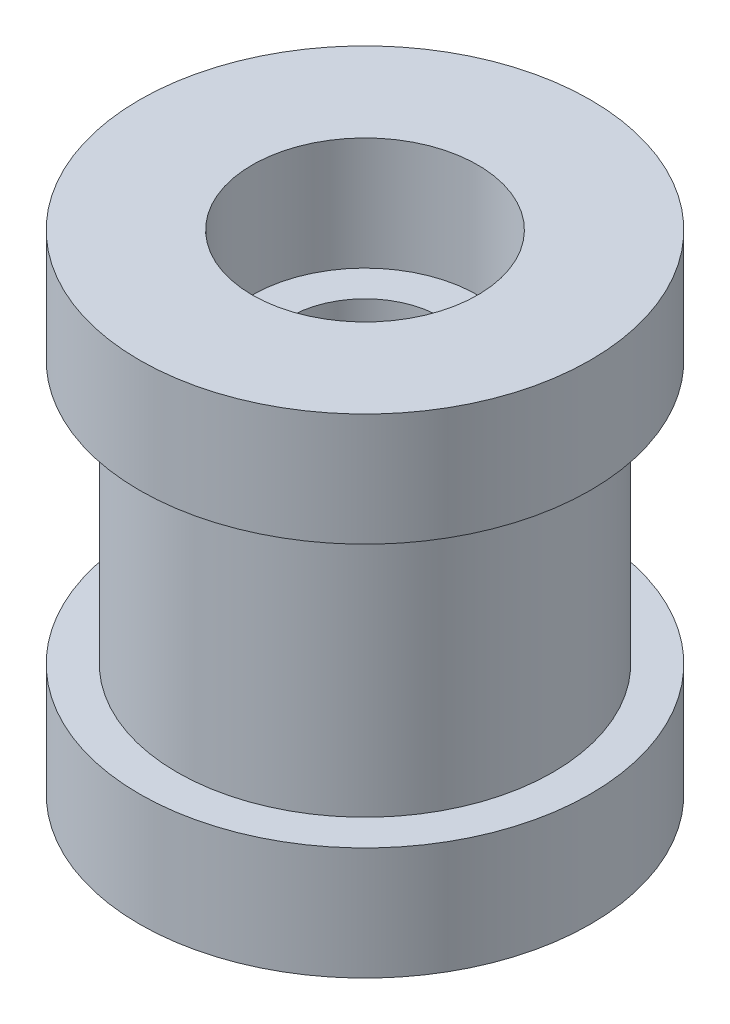
ISO-10303-21;
HEADER;
FILE_DESCRIPTION(('STEP AP214'),'2;1');
FILE_NAME('part.step','',(''),(''),'','','');
FILE_SCHEMA(('AUTOMOTIVE_DESIGN { 1 0 10303 214 1 1 1 1 }'));
ENDSEC;
DATA;
#1=APPLICATION_CONTEXT('core data for automotive mechanical design processes');
#2=APPLICATION_PROTOCOL_DEFINITION('international standard','automotive_design',2000,#1);
#3=PRODUCT_CONTEXT('',#1,'mechanical');
#4=PRODUCT('Part','Part','',(#3));
#5=PRODUCT_RELATED_PRODUCT_CATEGORY('part','',(#4));
#6=PRODUCT_DEFINITION_FORMATION('','',#4);
#7=PRODUCT_DEFINITION_CONTEXT('part definition',#1,'design');
#8=PRODUCT_DEFINITION('design','',#6,#7);
#9=PRODUCT_DEFINITION_SHAPE('','',#8);
#10=(LENGTH_UNIT() NAMED_UNIT(*) SI_UNIT(.MILLI.,.METRE.));
#11=(NAMED_UNIT(*) PLANE_ANGLE_UNIT() SI_UNIT($,.RADIAN.));
#12=(NAMED_UNIT(*) SI_UNIT($,.STERADIAN.) SOLID_ANGLE_UNIT());
#13=UNCERTAINTY_MEASURE_WITH_UNIT(LENGTH_MEASURE(1.E-05),#10,'distance_accuracy_value','');
#14=(GEOMETRIC_REPRESENTATION_CONTEXT(3) GLOBAL_UNCERTAINTY_ASSIGNED_CONTEXT((#13)) GLOBAL_UNIT_ASSIGNED_CONTEXT((#10,
#11,#12)) REPRESENTATION_CONTEXT('',''));
#15=CARTESIAN_POINT('',(0.,0.,0.));
#16=DIRECTION('',(0.,0.,1.));
#17=DIRECTION('',(1.,0.,0.));
#18=AXIS2_PLACEMENT_3D('',#15,#16,#17);
#19=CARTESIAN_POINT('',(0.,96.4583718666393,0.));
#20=DIRECTION('',(0.,1.,0.));
#21=DIRECTION('',(0.,0.,1.));
#22=AXIS2_PLACEMENT_3D('',#19,#20,#21);
#23=CYLINDRICAL_SURFACE('',#22,60.);
#24=CARTESIAN_POINT('',(0.,36.4841116520953,0.));
#25=DIRECTION('',(0.,1.,0.));
#26=DIRECTION('',(0.,0.,1.));
#27=AXIS2_PLACEMENT_3D('',#24,#25,#26);
#28=CIRCLE('',#27,60.);
#29=CARTESIAN_POINT('',(0.,36.4841116520953,60.));
#30=VERTEX_POINT('',#29);
#31=EDGE_CURVE('E10',#30,#30,#28,.T.);
#32=ORIENTED_EDGE('',*,*,#31,.F.);
#33=EDGE_LOOP('',(#32));
#34=FACE_BOUND('',#33,.T.);
#35=CARTESIAN_POINT('',(0.,6.48411165209527,0.));
#36=DIRECTION('',(0.,1.,0.));
#37=DIRECTION('',(0.,0.,1.));
#38=AXIS2_PLACEMENT_3D('',#35,#36,#37);
#39=CIRCLE('',#38,60.);
#40=CARTESIAN_POINT('',(0.,6.48411165209527,60.));
#41=VERTEX_POINT('',#40);
#42=EDGE_CURVE('E85',#41,#41,#39,.T.);
#43=ORIENTED_EDGE('',*,*,#42,.T.);
#44=EDGE_LOOP('',(#43));
#45=FACE_BOUND('',#44,.T.);
#46=ADVANCED_FACE('F33',(#34,#45),#23,.T.);
#47=CARTESIAN_POINT('',(-45.,36.4841116520953,0.));
#48=DIRECTION('',(0.,-1.,0.));
#49=DIRECTION('',(0.,0.,-1.));
#50=AXIS2_PLACEMENT_3D('',#47,#48,#49);
#51=PLANE('',#50);
#52=CARTESIAN_POINT('',(0.,36.4841116520953,0.));
#53=DIRECTION('',(0.,1.,0.));
#54=DIRECTION('',(0.,0.,1.));
#55=AXIS2_PLACEMENT_3D('',#52,#53,#54);
#56=CIRCLE('',#55,30.);
#57=CARTESIAN_POINT('',(0.,36.4841116520953,30.));
#58=VERTEX_POINT('',#57);
#59=EDGE_CURVE('E39',#58,#58,#56,.T.);
#60=ORIENTED_EDGE('',*,*,#59,.F.);
#61=EDGE_LOOP('',(#60));
#62=FACE_BOUND('',#61,.T.);
#63=ORIENTED_EDGE('',*,*,#31,.T.);
#64=EDGE_LOOP('',(#63));
#65=FACE_BOUND('',#64,.T.);
#66=ADVANCED_FACE('F170',(#62,#65),#51,.F.);
#67=CARTESIAN_POINT('',(0.,96.4583718666393,0.));
#68=DIRECTION('',(0.,1.,0.));
#69=DIRECTION('',(0.,0.,1.));
#70=AXIS2_PLACEMENT_3D('',#67,#68,#69);
#71=CYLINDRICAL_SURFACE('',#70,30.);
#72=CARTESIAN_POINT('',(0.,6.48411165209527,0.));
#73=DIRECTION('',(0.,1.,0.));
#74=DIRECTION('',(0.,0.,1.));
#75=AXIS2_PLACEMENT_3D('',#72,#73,#74);
#76=CIRCLE('',#75,30.);
#77=CARTESIAN_POINT('',(0.,6.48411165209527,30.));
#78=VERTEX_POINT('',#77);
#79=EDGE_CURVE('E43',#78,#78,#76,.T.);
#80=ORIENTED_EDGE('',*,*,#79,.F.);
#81=EDGE_LOOP('',(#80));
#82=FACE_BOUND('',#81,.T.);
#83=ORIENTED_EDGE('',*,*,#59,.T.);
#84=EDGE_LOOP('',(#83));
#85=FACE_BOUND('',#84,.T.);
#86=ADVANCED_FACE('F165',(#82,#85),#71,.F.);
#87=CARTESIAN_POINT('',(-30.,6.48411165209527,0.));
#88=DIRECTION('',(0.,-1.,0.));
#89=DIRECTION('',(0.,0.,-1.));
#90=AXIS2_PLACEMENT_3D('',#87,#88,#89);
#91=PLANE('',#90);
#92=CARTESIAN_POINT('',(0.,6.48411165209527,0.));
#93=DIRECTION('',(0.,1.,0.));
#94=DIRECTION('',(0.,0.,1.));
#95=AXIS2_PLACEMENT_3D('',#92,#93,#94);
#96=CIRCLE('',#95,20.);
#97=CARTESIAN_POINT('',(0.,6.48411165209527,20.));
#98=VERTEX_POINT('',#97);
#99=EDGE_CURVE('E47',#98,#98,#96,.T.);
#100=ORIENTED_EDGE('',*,*,#99,.F.);
#101=EDGE_LOOP('',(#100));
#102=FACE_BOUND('',#101,.T.);
#103=ORIENTED_EDGE('',*,*,#79,.T.);
#104=EDGE_LOOP('',(#103));
#105=FACE_BOUND('',#104,.T.);
#106=ADVANCED_FACE('F159',(#102,#105),#91,.F.);
#107=CARTESIAN_POINT('',(0.,96.4583718666393,0.));
#108=DIRECTION('',(0.,1.,0.));
#109=DIRECTION('',(0.,0.,1.));
#110=AXIS2_PLACEMENT_3D('',#107,#108,#109);
#111=CYLINDRICAL_SURFACE('',#110,20.);
#112=CARTESIAN_POINT('',(0.,-8.51588834790472,0.));
#113=DIRECTION('',(0.,1.,0.));
#114=DIRECTION('',(0.,0.,1.));
#115=AXIS2_PLACEMENT_3D('',#112,#113,#114);
#116=CIRCLE('',#115,20.);
#117=CARTESIAN_POINT('',(0.,-8.51588834790472,20.));
#118=VERTEX_POINT('',#117);
#119=EDGE_CURVE('E52',#118,#118,#116,.T.);
#120=ORIENTED_EDGE('',*,*,#119,.F.);
#121=EDGE_LOOP('',(#120));
#122=FACE_BOUND('',#121,.T.);
#123=ORIENTED_EDGE('',*,*,#99,.T.);
#124=EDGE_LOOP('',(#123));
#125=FACE_BOUND('',#124,.T.);
#126=ADVANCED_FACE('F153',(#122,#125),#111,.F.);
#127=CARTESIAN_POINT('',(-27.5,-8.51588834790473,0.));
#128=DIRECTION('',(0.,1.,0.));
#129=DIRECTION('',(0.,0.,1.));
#130=AXIS2_PLACEMENT_3D('',#127,#128,#129);
#131=PLANE('',#130);
#132=CARTESIAN_POINT('',(0.,-8.51588834790473,0.));
#133=DIRECTION('',(0.,1.,0.));
#134=DIRECTION('',(0.,0.,1.));
#135=AXIS2_PLACEMENT_3D('',#132,#133,#134);
#136=CIRCLE('',#135,35.);
#137=CARTESIAN_POINT('',(0.,-8.51588834790473,35.));
#138=VERTEX_POINT('',#137);
#139=EDGE_CURVE('E55',#138,#138,#136,.T.);
#140=ORIENTED_EDGE('',*,*,#139,.F.);
#141=EDGE_LOOP('',(#140));
#142=FACE_BOUND('',#141,.T.);
#143=ORIENTED_EDGE('',*,*,#119,.T.);
#144=EDGE_LOOP('',(#143));
#145=FACE_BOUND('',#144,.T.);
#146=ADVANCED_FACE('F147',(#142,#145),#131,.F.);
#147=CARTESIAN_POINT('',(0.,96.4583718666393,0.));
#148=DIRECTION('',(0.,1.,0.));
#149=DIRECTION('',(0.,0.,1.));
#150=AXIS2_PLACEMENT_3D('',#147,#148,#149);
#151=CYLINDRICAL_SURFACE('',#150,35.);
#152=CARTESIAN_POINT('',(0.,-48.5158883479047,0.));
#153=DIRECTION('',(0.,1.,0.));
#154=DIRECTION('',(0.,0.,1.));
#155=AXIS2_PLACEMENT_3D('',#152,#153,#154);
#156=CIRCLE('',#155,35.);
#157=CARTESIAN_POINT('',(0.,-48.5158883479047,35.));
#158=VERTEX_POINT('',#157);
#159=EDGE_CURVE('E58',#158,#158,#156,.T.);
#160=ORIENTED_EDGE('',*,*,#159,.F.);
#161=EDGE_LOOP('',(#160));
#162=FACE_BOUND('',#161,.T.);
#163=ORIENTED_EDGE('',*,*,#139,.T.);
#164=EDGE_LOOP('',(#163));
#165=FACE_BOUND('',#164,.T.);
#166=ADVANCED_FACE('F141',(#162,#165),#151,.F.);
#167=CARTESIAN_POINT('',(-35.,-48.5158883479047,0.));
#168=DIRECTION('',(0.,-1.,0.));
#169=DIRECTION('',(0.,0.,-1.));
#170=AXIS2_PLACEMENT_3D('',#167,#168,#169);
#171=PLANE('',#170);
#172=CARTESIAN_POINT('',(0.,-48.5158883479047,0.));
#173=DIRECTION('',(0.,1.,0.));
#174=DIRECTION('',(0.,0.,1.));
#175=AXIS2_PLACEMENT_3D('',#172,#173,#174);
#176=CIRCLE('',#175,20.);
#177=CARTESIAN_POINT('',(0.,-48.5158883479047,20.));
#178=VERTEX_POINT('',#177);
#179=EDGE_CURVE('E61',#178,#178,#176,.T.);
#180=ORIENTED_EDGE('',*,*,#179,.F.);
#181=EDGE_LOOP('',(#180));
#182=FACE_BOUND('',#181,.T.);
#183=ORIENTED_EDGE('',*,*,#159,.T.);
#184=EDGE_LOOP('',(#183));
#185=FACE_BOUND('',#184,.T.);
#186=ADVANCED_FACE('F135',(#182,#185),#171,.F.);
#187=CARTESIAN_POINT('',(0.,96.4583718666393,0.));
#188=DIRECTION('',(0.,1.,0.));
#189=DIRECTION('',(0.,0.,1.));
#190=AXIS2_PLACEMENT_3D('',#187,#188,#189);
#191=CYLINDRICAL_SURFACE('',#190,20.);
#192=CARTESIAN_POINT('',(0.,-63.5158883479047,0.));
#193=DIRECTION('',(0.,1.,0.));
#194=DIRECTION('',(0.,0.,1.));
#195=AXIS2_PLACEMENT_3D('',#192,#193,#194);
#196=CIRCLE('',#195,20.);
#197=CARTESIAN_POINT('',(0.,-63.5158883479047,20.));
#198=VERTEX_POINT('',#197);
#199=EDGE_CURVE('E64',#198,#198,#196,.T.);
#200=ORIENTED_EDGE('',*,*,#199,.F.);
#201=EDGE_LOOP('',(#200));
#202=FACE_BOUND('',#201,.T.);
#203=ORIENTED_EDGE('',*,*,#179,.T.);
#204=EDGE_LOOP('',(#203));
#205=FACE_BOUND('',#204,.T.);
#206=ADVANCED_FACE('F129',(#202,#205),#191,.F.);
#207=CARTESIAN_POINT('',(-20.,-63.5158883479047,0.));
#208=DIRECTION('',(0.,1.,0.));
#209=DIRECTION('',(0.,0.,1.));
#210=AXIS2_PLACEMENT_3D('',#207,#208,#209);
#211=PLANE('',#210);
#212=CARTESIAN_POINT('',(0.,-63.5158883479047,0.));
#213=DIRECTION('',(0.,1.,0.));
#214=DIRECTION('',(0.,0.,1.));
#215=AXIS2_PLACEMENT_3D('',#212,#213,#214);
#216=CIRCLE('',#215,30.);
#217=CARTESIAN_POINT('',(0.,-63.5158883479047,30.));
#218=VERTEX_POINT('',#217);
#219=EDGE_CURVE('E67',#218,#218,#216,.T.);
#220=ORIENTED_EDGE('',*,*,#219,.F.);
#221=EDGE_LOOP('',(#220));
#222=FACE_BOUND('',#221,.T.);
#223=ORIENTED_EDGE('',*,*,#199,.T.);
#224=EDGE_LOOP('',(#223));
#225=FACE_BOUND('',#224,.T.);
#226=ADVANCED_FACE('F123',(#222,#225),#211,.F.);
#227=CARTESIAN_POINT('',(0.,96.4583718666393,0.));
#228=DIRECTION('',(0.,1.,0.));
#229=DIRECTION('',(0.,0.,1.));
#230=AXIS2_PLACEMENT_3D('',#227,#228,#229);
#231=CYLINDRICAL_SURFACE('',#230,30.);
#232=CARTESIAN_POINT('',(0.,-93.5158883479047,0.));
#233=DIRECTION('',(0.,1.,0.));
#234=DIRECTION('',(0.,0.,1.));
#235=AXIS2_PLACEMENT_3D('',#232,#233,#234);
#236=CIRCLE('',#235,30.);
#237=CARTESIAN_POINT('',(0.,-93.5158883479047,30.));
#238=VERTEX_POINT('',#237);
#239=EDGE_CURVE('E70',#238,#238,#236,.T.);
#240=ORIENTED_EDGE('',*,*,#239,.F.);
#241=EDGE_LOOP('',(#240));
#242=FACE_BOUND('',#241,.T.);
#243=ORIENTED_EDGE('',*,*,#219,.T.);
#244=EDGE_LOOP('',(#243));
#245=FACE_BOUND('',#244,.T.);
#246=ADVANCED_FACE('F117',(#242,#245),#231,.F.);
#247=CARTESIAN_POINT('',(-30.,-93.5158883479047,0.));
#248=DIRECTION('',(0.,1.,0.));
#249=DIRECTION('',(0.,0.,1.));
#250=AXIS2_PLACEMENT_3D('',#247,#248,#249);
#251=PLANE('',#250);
#252=CARTESIAN_POINT('',(0.,-93.5158883479047,0.));
#253=DIRECTION('',(0.,1.,0.));
#254=DIRECTION('',(0.,0.,1.));
#255=AXIS2_PLACEMENT_3D('',#252,#253,#254);
#256=CIRCLE('',#255,60.);
#257=CARTESIAN_POINT('',(0.,-93.5158883479047,60.));
#258=VERTEX_POINT('',#257);
#259=EDGE_CURVE('E73',#258,#258,#256,.T.);
#260=ORIENTED_EDGE('',*,*,#259,.F.);
#261=EDGE_LOOP('',(#260));
#262=FACE_BOUND('',#261,.T.);
#263=ORIENTED_EDGE('',*,*,#239,.T.);
#264=EDGE_LOOP('',(#263));
#265=FACE_BOUND('',#264,.T.);
#266=ADVANCED_FACE('F111',(#262,#265),#251,.F.);
#267=CARTESIAN_POINT('',(0.,96.4583718666393,0.));
#268=DIRECTION('',(0.,1.,0.));
#269=DIRECTION('',(0.,0.,1.));
#270=AXIS2_PLACEMENT_3D('',#267,#268,#269);
#271=CYLINDRICAL_SURFACE('',#270,60.);
#272=CARTESIAN_POINT('',(0.,-63.5158883479047,0.));
#273=DIRECTION('',(0.,1.,0.));
#274=DIRECTION('',(0.,0.,1.));
#275=AXIS2_PLACEMENT_3D('',#272,#273,#274);
#276=CIRCLE('',#275,60.);
#277=CARTESIAN_POINT('',(0.,-63.5158883479047,60.));
#278=VERTEX_POINT('',#277);
#279=EDGE_CURVE('E76',#278,#278,#276,.T.);
#280=ORIENTED_EDGE('',*,*,#279,.F.);
#281=EDGE_LOOP('',(#280));
#282=FACE_BOUND('',#281,.T.);
#283=ORIENTED_EDGE('',*,*,#259,.T.);
#284=EDGE_LOOP('',(#283));
#285=FACE_BOUND('',#284,.T.);
#286=ADVANCED_FACE('F105',(#282,#285),#271,.T.);
#287=CARTESIAN_POINT('',(-60.,-63.5158883479047,0.));
#288=DIRECTION('',(0.,-1.,0.));
#289=DIRECTION('',(0.,0.,-1.));
#290=AXIS2_PLACEMENT_3D('',#287,#288,#289);
#291=PLANE('',#290);
#292=CARTESIAN_POINT('',(0.,-63.5158883479047,0.));
#293=DIRECTION('',(0.,1.,0.));
#294=DIRECTION('',(0.,0.,1.));
#295=AXIS2_PLACEMENT_3D('',#292,#293,#294);
#296=CIRCLE('',#295,50.);
#297=CARTESIAN_POINT('',(0.,-63.5158883479047,50.));
#298=VERTEX_POINT('',#297);
#299=EDGE_CURVE('E79',#298,#298,#296,.T.);
#300=ORIENTED_EDGE('',*,*,#299,.F.);
#301=EDGE_LOOP('',(#300));
#302=FACE_BOUND('',#301,.T.);
#303=ORIENTED_EDGE('',*,*,#279,.T.);
#304=EDGE_LOOP('',(#303));
#305=FACE_BOUND('',#304,.T.);
#306=ADVANCED_FACE('F99',(#302,#305),#291,.F.);
#307=CARTESIAN_POINT('',(0.,96.4583718666393,0.));
#308=DIRECTION('',(0.,1.,0.));
#309=DIRECTION('',(0.,0.,1.));
#310=AXIS2_PLACEMENT_3D('',#307,#308,#309);
#311=CYLINDRICAL_SURFACE('',#310,50.);
#312=CARTESIAN_POINT('',(0.,6.48411165209528,0.));
#313=DIRECTION('',(0.,1.,0.));
#314=DIRECTION('',(0.,0.,1.));
#315=AXIS2_PLACEMENT_3D('',#312,#313,#314);
#316=CIRCLE('',#315,50.);
#317=CARTESIAN_POINT('',(0.,6.48411165209528,50.));
#318=VERTEX_POINT('',#317);
#319=EDGE_CURVE('E82',#318,#318,#316,.T.);
#320=ORIENTED_EDGE('',*,*,#319,.F.);
#321=EDGE_LOOP('',(#320));
#322=FACE_BOUND('',#321,.T.);
#323=ORIENTED_EDGE('',*,*,#299,.T.);
#324=EDGE_LOOP('',(#323));
#325=FACE_BOUND('',#324,.T.);
#326=ADVANCED_FACE('F93',(#322,#325),#311,.T.);
#327=CARTESIAN_POINT('',(-50.,6.48411165209528,0.));
#328=DIRECTION('',(0.,1.,0.));
#329=DIRECTION('',(0.,0.,1.));
#330=AXIS2_PLACEMENT_3D('',#327,#328,#329);
#331=PLANE('',#330);
#332=ORIENTED_EDGE('',*,*,#42,.F.);
#333=EDGE_LOOP('',(#332));
#334=FACE_BOUND('',#333,.T.);
#335=ORIENTED_EDGE('',*,*,#319,.T.);
#336=EDGE_LOOP('',(#335));
#337=FACE_BOUND('',#336,.T.);
#338=ADVANCED_FACE('F90',(#334,#337),#331,.F.);
#339=CLOSED_SHELL('',(#46,#66,#86,#106,#126,#146,#166,#186,#206,#226,#246,#266,#286,#306,#326,#338));
#340=MANIFOLD_SOLID_BREP('B2',#339);
#341=ADVANCED_BREP_SHAPE_REPRESENTATION('',(#18,#340),#14);
#342=SHAPE_DEFINITION_REPRESENTATION(#9,#341);
ENDSEC;
END-ISO-10303-21;
